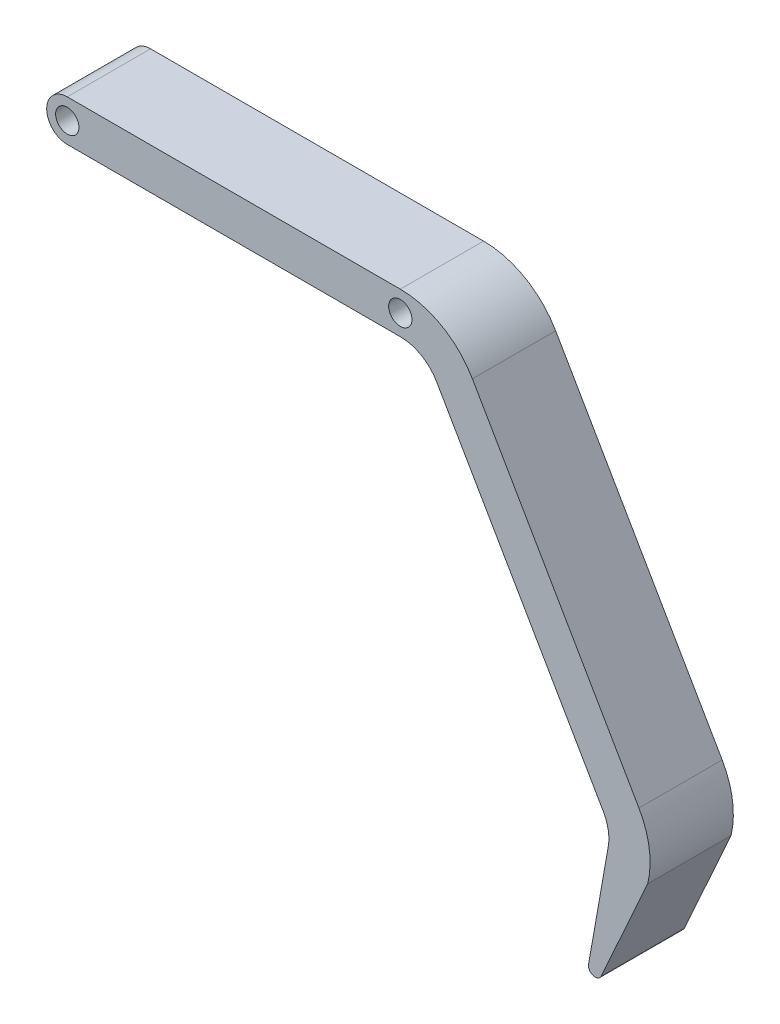
ISO-10303-21;
HEADER;
FILE_DESCRIPTION(('STEP AP214'),'2;1');
FILE_NAME('part.step','',(''),(''),'','','');
FILE_SCHEMA(('AUTOMOTIVE_DESIGN { 1 0 10303 214 1 1 1 1 }'));
ENDSEC;
DATA;
#1=APPLICATION_CONTEXT('core data for automotive mechanical design processes');
#2=APPLICATION_PROTOCOL_DEFINITION('international standard','automotive_design',2000,#1);
#3=PRODUCT_CONTEXT('',#1,'mechanical');
#4=PRODUCT('Part','Part','',(#3));
#5=PRODUCT_RELATED_PRODUCT_CATEGORY('part','',(#4));
#6=PRODUCT_DEFINITION_FORMATION('','',#4);
#7=PRODUCT_DEFINITION_CONTEXT('part definition',#1,'design');
#8=PRODUCT_DEFINITION('design','',#6,#7);
#9=PRODUCT_DEFINITION_SHAPE('','',#8);
#10=(LENGTH_UNIT() NAMED_UNIT(*) SI_UNIT(.MILLI.,.METRE.));
#11=(NAMED_UNIT(*) PLANE_ANGLE_UNIT() SI_UNIT($,.RADIAN.));
#12=(NAMED_UNIT(*) SI_UNIT($,.STERADIAN.) SOLID_ANGLE_UNIT());
#13=UNCERTAINTY_MEASURE_WITH_UNIT(LENGTH_MEASURE(1.E-05),#10,'distance_accuracy_value','');
#14=(GEOMETRIC_REPRESENTATION_CONTEXT(3) GLOBAL_UNCERTAINTY_ASSIGNED_CONTEXT((#13)) GLOBAL_UNIT_ASSIGNED_CONTEXT((#10,
#11,#12)) REPRESENTATION_CONTEXT('',''));
#15=CARTESIAN_POINT('',(0.,0.,0.));
#16=DIRECTION('',(0.,0.,1.));
#17=DIRECTION('',(1.,0.,0.));
#18=AXIS2_PLACEMENT_3D('',#15,#16,#17);
#19=CARTESIAN_POINT('',(-25.4,-3.14284244351836,12.7));
#20=DIRECTION('',(0.,0.,-1.));
#21=DIRECTION('',(-1.,0.,0.));
#22=AXIS2_PLACEMENT_3D('',#19,#20,#21);
#23=CYLINDRICAL_SURFACE('',#22,3.14284244351837);
#24=CARTESIAN_POINT('',(-25.4,-3.14284244351836,0.));
#25=DIRECTION('',(0.,0.,1.));
#26=DIRECTION('',(1.,0.,0.));
#27=AXIS2_PLACEMENT_3D('',#24,#25,#26);
#28=CIRCLE('',#27,3.14284244351837);
#29=CARTESIAN_POINT('',(-25.4,0.,0.));
#30=VERTEX_POINT('',#29);
#31=CARTESIAN_POINT('',(-25.4,-6.28568488703673,0.));
#32=VERTEX_POINT('',#31);
#33=EDGE_CURVE('E151',#30,#32,#28,.T.);
#34=ORIENTED_EDGE('',*,*,#33,.T.);
#35=DIRECTION('',(0.,0.,-1.));
#36=VECTOR('',#35,1.);
#37=CARTESIAN_POINT('',(-25.4,-6.28568488703673,12.7));
#38=LINE('',#37,#36);
#39=CARTESIAN_POINT('',(-25.4,-6.28568488703673,12.7));
#40=VERTEX_POINT('',#39);
#41=EDGE_CURVE('E132',#40,#32,#38,.T.);
#42=ORIENTED_EDGE('',*,*,#41,.F.);
#43=CARTESIAN_POINT('',(-25.4,-3.14284244351836,12.7));
#44=DIRECTION('',(0.,0.,1.));
#45=DIRECTION('',(1.,0.,0.));
#46=AXIS2_PLACEMENT_3D('',#43,#44,#45);
#47=CIRCLE('',#46,3.14284244351837);
#48=CARTESIAN_POINT('',(-25.4,0.,12.7));
#49=VERTEX_POINT('',#48);
#50=EDGE_CURVE('E139',#49,#40,#47,.T.);
#51=ORIENTED_EDGE('',*,*,#50,.F.);
#52=DIRECTION('',(0.,0.,-1.));
#53=VECTOR('',#52,1.);
#54=CARTESIAN_POINT('',(-25.4,0.,12.7));
#55=LINE('',#54,#53);
#56=EDGE_CURVE('E180',#49,#30,#55,.T.);
#57=ORIENTED_EDGE('',*,*,#56,.T.);
#58=EDGE_LOOP('',(#34,#42,#51,#57));
#59=FACE_BOUND('',#58,.T.);
#60=ADVANCED_FACE('F39',(#59),#23,.T.);
#61=CARTESIAN_POINT('',(-25.4,-6.28568488703673,12.7));
#62=DIRECTION('',(0.,1.,0.));
#63=DIRECTION('',(-1.,0.,0.));
#64=AXIS2_PLACEMENT_3D('',#61,#62,#63);
#65=PLANE('',#64);
#66=DIRECTION('',(1.,0.,0.));
#67=VECTOR('',#66,1.);
#68=CARTESIAN_POINT('',(-25.4,-6.28568488703673,0.));
#69=LINE('',#68,#67);
#70=CARTESIAN_POINT('',(25.4,-6.28568488703674,0.));
#71=VERTEX_POINT('',#70);
#72=EDGE_CURVE('E199',#32,#71,#69,.T.);
#73=ORIENTED_EDGE('',*,*,#72,.T.);
#74=DIRECTION('',(0.,0.,-1.));
#75=VECTOR('',#74,1.);
#76=CARTESIAN_POINT('',(25.4,-6.28568488703674,12.7));
#77=LINE('',#76,#75);
#78=CARTESIAN_POINT('',(25.4,-6.28568488703674,12.7));
#79=VERTEX_POINT('',#78);
#80=EDGE_CURVE('E135',#79,#71,#77,.T.);
#81=ORIENTED_EDGE('',*,*,#80,.F.);
#82=DIRECTION('',(1.,0.,0.));
#83=VECTOR('',#82,1.);
#84=CARTESIAN_POINT('',(-25.4,-6.28568488703673,12.7));
#85=LINE('',#84,#83);
#86=EDGE_CURVE('E128',#40,#79,#85,.T.);
#87=ORIENTED_EDGE('',*,*,#86,.F.);
#88=ORIENTED_EDGE('',*,*,#41,.T.);
#89=EDGE_LOOP('',(#73,#81,#87,#88));
#90=FACE_BOUND('',#89,.T.);
#91=ADVANCED_FACE('F130',(#90),#65,.F.);
#92=CARTESIAN_POINT('',(25.4,-12.7,12.7));
#93=DIRECTION('',(0.,0.,-1.));
#94=DIRECTION('',(-1.,0.,0.));
#95=AXIS2_PLACEMENT_3D('',#92,#93,#94);
#96=CYLINDRICAL_SURFACE('',#95,6.41431511296327);
#97=CARTESIAN_POINT('',(25.4,-12.7,0.));
#98=DIRECTION('',(0.,0.,-1.));
#99=DIRECTION('',(-1.,0.,0.));
#100=AXIS2_PLACEMENT_3D('',#97,#98,#99);
#101=CIRCLE('',#100,6.41431511296327);
#102=CARTESIAN_POINT('',(30.9549598357046,-9.49284244351838,0.));
#103=VERTEX_POINT('',#102);
#104=EDGE_CURVE('E197',#71,#103,#101,.T.);
#105=ORIENTED_EDGE('',*,*,#104,.T.);
#106=DIRECTION('',(0.,0.,-1.));
#107=VECTOR('',#106,1.);
#108=CARTESIAN_POINT('',(30.9549598357046,-9.49284244351838,12.7));
#109=LINE('',#108,#107);
#110=CARTESIAN_POINT('',(30.9549598357046,-9.49284244351838,12.7));
#111=VERTEX_POINT('',#110);
#112=EDGE_CURVE('E156',#111,#103,#109,.T.);
#113=ORIENTED_EDGE('',*,*,#112,.F.);
#114=CARTESIAN_POINT('',(25.4,-12.7,12.7));
#115=DIRECTION('',(0.,0.,-1.));
#116=DIRECTION('',(-1.,0.,0.));
#117=AXIS2_PLACEMENT_3D('',#114,#115,#116);
#118=CIRCLE('',#117,6.41431511296327);
#119=EDGE_CURVE('E138',#79,#111,#118,.T.);
#120=ORIENTED_EDGE('',*,*,#119,.F.);
#121=ORIENTED_EDGE('',*,*,#80,.T.);
#122=EDGE_LOOP('',(#105,#113,#120,#121));
#123=FACE_BOUND('',#122,.T.);
#124=ADVANCED_FACE('F264',(#123),#96,.F.);
#125=CARTESIAN_POINT('',(30.9549598357046,-9.49284244351838,12.7));
#126=DIRECTION('',(0.86602540378444,0.499999999999998,0.));
#127=DIRECTION('',(-0.499999999999998,0.86602540378444,0.));
#128=AXIS2_PLACEMENT_3D('',#125,#126,#127);
#129=PLANE('',#128);
#130=DIRECTION('',(0.499999999999998,-0.86602540378444,0.));
#131=VECTOR('',#130,1.);
#132=CARTESIAN_POINT('',(30.9549598357046,-9.49284244351838,0.));
#133=LINE('',#132,#131);
#134=CARTESIAN_POINT('',(56.3549598357045,-53.4869329557679,0.));
#135=VERTEX_POINT('',#134);
#136=EDGE_CURVE('E195',#103,#135,#133,.T.);
#137=ORIENTED_EDGE('',*,*,#136,.T.);
#138=DIRECTION('',(0.,0.,-1.));
#139=VECTOR('',#138,1.);
#140=CARTESIAN_POINT('',(56.3549598357045,-53.4869329557679,12.7));
#141=LINE('',#140,#139);
#142=CARTESIAN_POINT('',(56.3549598357045,-53.4869329557679,12.7));
#143=VERTEX_POINT('',#142);
#144=EDGE_CURVE('E162',#143,#135,#141,.T.);
#145=ORIENTED_EDGE('',*,*,#144,.F.);
#146=DIRECTION('',(0.499999999999998,-0.86602540378444,0.));
#147=VECTOR('',#146,1.);
#148=CARTESIAN_POINT('',(30.9549598357046,-9.49284244351838,12.7));
#149=LINE('',#148,#147);
#150=EDGE_CURVE('E216',#111,#143,#149,.T.);
#151=ORIENTED_EDGE('',*,*,#150,.F.);
#152=ORIENTED_EDGE('',*,*,#112,.T.);
#153=EDGE_LOOP('',(#137,#145,#151,#152));
#154=FACE_BOUND('',#153,.T.);
#155=ADVANCED_FACE('F269',(#154),#129,.F.);
#156=CARTESIAN_POINT('',(50.7999999999999,-56.6940905122495,12.7));
#157=DIRECTION('',(0.,0.,-1.));
#158=DIRECTION('',(-1.,0.,0.));
#159=AXIS2_PLACEMENT_3D('',#156,#157,#158);
#160=CYLINDRICAL_SURFACE('',#159,6.41431511296323);
#161=CARTESIAN_POINT('',(50.7999999999999,-56.6940905122495,0.));
#162=DIRECTION('',(0.,0.,-1.));
#163=DIRECTION('',(-1.,0.,0.));
#164=AXIS2_PLACEMENT_3D('',#161,#162,#163);
#165=CIRCLE('',#164,6.41431511296323);
#166=CARTESIAN_POINT('',(57.1168672535094,-57.8079246425971,0.));
#167=VERTEX_POINT('',#166);
#168=EDGE_CURVE('E193',#135,#167,#165,.T.);
#169=ORIENTED_EDGE('',*,*,#168,.T.);
#170=DIRECTION('',(0.,0.,-1.));
#171=VECTOR('',#170,1.);
#172=CARTESIAN_POINT('',(57.1168672535094,-57.8079246425971,12.7));
#173=LINE('',#172,#171);
#174=CARTESIAN_POINT('',(57.1168672535094,-57.8079246425971,12.7));
#175=VERTEX_POINT('',#174);
#176=EDGE_CURVE('E165',#175,#167,#173,.T.);
#177=ORIENTED_EDGE('',*,*,#176,.F.);
#178=CARTESIAN_POINT('',(50.7999999999999,-56.6940905122495,12.7));
#179=DIRECTION('',(0.,0.,-1.));
#180=DIRECTION('',(-1.,0.,0.));
#181=AXIS2_PLACEMENT_3D('',#178,#179,#180);
#182=CIRCLE('',#181,6.41431511296323);
#183=EDGE_CURVE('E214',#143,#175,#182,.T.);
#184=ORIENTED_EDGE('',*,*,#183,.F.);
#185=ORIENTED_EDGE('',*,*,#144,.T.);
#186=EDGE_LOOP('',(#169,#177,#184,#185));
#187=FACE_BOUND('',#186,.T.);
#188=ADVANCED_FACE('F273',(#187),#160,.F.);
#189=CARTESIAN_POINT('',(57.1168672535094,-57.8079246425971,12.7));
#190=DIRECTION('',(0.984807753012207,-0.173648177666935,0.));
#191=DIRECTION('',(0.173648177666935,0.984807753012207,0.));
#192=AXIS2_PLACEMENT_3D('',#189,#190,#191);
#193=PLANE('',#192);
#194=DIRECTION('',(-0.173648177666935,-0.984807753012207,0.));
#195=VECTOR('',#194,1.);
#196=CARTESIAN_POINT('',(57.1168672535094,-57.8079246425971,0.));
#197=LINE('',#196,#195);
#198=CARTESIAN_POINT('',(54.115484799693,-74.8296103866452,0.));
#199=VERTEX_POINT('',#198);
#200=EDGE_CURVE('E191',#167,#199,#197,.T.);
#201=ORIENTED_EDGE('',*,*,#200,.T.);
#202=DIRECTION('',(0.,0.,-1.));
#203=VECTOR('',#202,1.);
#204=CARTESIAN_POINT('',(54.115484799693,-74.8296103866452,12.7));
#205=LINE('',#204,#203);
#206=CARTESIAN_POINT('',(54.115484799693,-74.8296103866452,12.7));
#207=VERTEX_POINT('',#206);
#208=EDGE_CURVE('E47',#199,#207,#205,.F.);
#209=ORIENTED_EDGE('',*,*,#208,.T.);
#210=DIRECTION('',(-0.173648177666935,-0.984807753012207,0.));
#211=VECTOR('',#210,1.);
#212=CARTESIAN_POINT('',(57.1168672535094,-57.8079246425971,12.7));
#213=LINE('',#212,#211);
#214=EDGE_CURVE('E212',#175,#207,#213,.T.);
#215=ORIENTED_EDGE('',*,*,#214,.F.);
#216=ORIENTED_EDGE('',*,*,#176,.T.);
#217=EDGE_LOOP('',(#201,#209,#215,#216));
#218=FACE_BOUND('',#217,.T.);
#219=ADVANCED_FACE('F277',(#218),#193,.F.);
#220=CARTESIAN_POINT('',(52.7062035407693,-82.8220415691072,12.7));
#221=DIRECTION('',(-0.911608864925694,0.411058727420898,0.));
#222=DIRECTION('',(-0.411058727420898,-0.911608864925694,0.));
#223=AXIS2_PLACEMENT_3D('',#220,#221,#222);
#224=PLANE('',#223);
#225=DIRECTION('',(0.411058727420898,0.911608864925694,0.));
#226=VECTOR('',#225,1.);
#227=CARTESIAN_POINT('',(52.7062035407693,-82.8220415691072,12.7));
#228=LINE('',#227,#226);
#229=CARTESIAN_POINT('',(56.0422440835179,-75.4236726022145,12.7));
#230=VERTEX_POINT('',#229);
#231=CARTESIAN_POINT('',(63.1470952172601,-59.6671763999946,12.7));
#232=VERTEX_POINT('',#231);
#233=EDGE_CURVE('E210',#230,#232,#228,.T.);
#234=ORIENTED_EDGE('',*,*,#233,.F.);
#235=DIRECTION('',(0.,0.,-1.));
#236=VECTOR('',#235,1.);
#237=CARTESIAN_POINT('',(56.0422440835179,-75.4236726022145,12.7));
#238=LINE('',#237,#236);
#239=CARTESIAN_POINT('',(56.0422440835179,-75.4236726022145,0.));
#240=VERTEX_POINT('',#239);
#241=EDGE_CURVE('E152',#230,#240,#238,.T.);
#242=ORIENTED_EDGE('',*,*,#241,.T.);
#243=DIRECTION('',(0.411058727420898,0.911608864925694,0.));
#244=VECTOR('',#243,1.);
#245=CARTESIAN_POINT('',(52.7062035407693,-82.8220415691072,0.));
#246=LINE('',#245,#244);
#247=CARTESIAN_POINT('',(63.1470952172601,-59.6671763999946,0.));
#248=VERTEX_POINT('',#247);
#249=EDGE_CURVE('E189',#240,#248,#246,.T.);
#250=ORIENTED_EDGE('',*,*,#249,.T.);
#251=DIRECTION('',(0.,0.,-1.));
#252=VECTOR('',#251,1.);
#253=CARTESIAN_POINT('',(63.1470952172601,-59.6671763999946,12.7));
#254=LINE('',#253,#252);
#255=EDGE_CURVE('E168',#232,#248,#254,.T.);
#256=ORIENTED_EDGE('',*,*,#255,.F.);
#257=EDGE_LOOP('',(#234,#242,#250,#256));
#258=FACE_BOUND('',#257,.T.);
#259=ADVANCED_FACE('F245',(#258),#224,.F.);
#260=CARTESIAN_POINT('',(50.7999999999999,-56.6940905122495,12.7));
#261=DIRECTION('',(0.,0.,-1.));
#262=DIRECTION('',(-1.,0.,0.));
#263=AXIS2_PLACEMENT_3D('',#260,#261,#262);
#264=CYLINDRICAL_SURFACE('',#263,12.7);
#265=CARTESIAN_POINT('',(50.7999999999999,-56.6940905122495,0.));
#266=DIRECTION('',(0.,0.,1.));
#267=DIRECTION('',(-1.,0.,0.));
#268=AXIS2_PLACEMENT_3D('',#265,#266,#267);
#269=CIRCLE('',#268,12.7);
#270=CARTESIAN_POINT('',(61.7985226280623,-50.3440905122496,0.));
#271=VERTEX_POINT('',#270);
#272=EDGE_CURVE('E187',#248,#271,#269,.T.);
#273=ORIENTED_EDGE('',*,*,#272,.T.);
#274=DIRECTION('',(0.,0.,-1.));
#275=VECTOR('',#274,1.);
#276=CARTESIAN_POINT('',(61.7985226280623,-50.3440905122496,12.7));
#277=LINE('',#276,#275);
#278=CARTESIAN_POINT('',(61.7985226280623,-50.3440905122496,12.7));
#279=VERTEX_POINT('',#278);
#280=EDGE_CURVE('E171',#279,#271,#277,.T.);
#281=ORIENTED_EDGE('',*,*,#280,.F.);
#282=CARTESIAN_POINT('',(50.7999999999999,-56.6940905122495,12.7));
#283=DIRECTION('',(0.,0.,1.));
#284=DIRECTION('',(-1.,0.,0.));
#285=AXIS2_PLACEMENT_3D('',#282,#283,#284);
#286=CIRCLE('',#285,12.7);
#287=EDGE_CURVE('E208',#232,#279,#286,.T.);
#288=ORIENTED_EDGE('',*,*,#287,.F.);
#289=ORIENTED_EDGE('',*,*,#255,.T.);
#290=EDGE_LOOP('',(#273,#281,#288,#289));
#291=FACE_BOUND('',#290,.T.);
#292=ADVANCED_FACE('F249',(#291),#264,.T.);
#293=CARTESIAN_POINT('',(36.3985226280624,-6.35000000000002,12.7));
#294=DIRECTION('',(-0.86602540378444,-0.499999999999998,0.));
#295=DIRECTION('',(0.499999999999998,-0.86602540378444,0.));
#296=AXIS2_PLACEMENT_3D('',#293,#294,#295);
#297=PLANE('',#296);
#298=DIRECTION('',(-0.499999999999998,0.86602540378444,0.));
#299=VECTOR('',#298,1.);
#300=CARTESIAN_POINT('',(36.3985226280624,-6.35000000000002,0.));
#301=LINE('',#300,#299);
#302=CARTESIAN_POINT('',(36.3985226280624,-6.35000000000002,0.));
#303=VERTEX_POINT('',#302);
#304=EDGE_CURVE('E185',#271,#303,#301,.T.);
#305=ORIENTED_EDGE('',*,*,#304,.T.);
#306=DIRECTION('',(0.,0.,-1.));
#307=VECTOR('',#306,1.);
#308=CARTESIAN_POINT('',(36.3985226280624,-6.35000000000002,12.7));
#309=LINE('',#308,#307);
#310=CARTESIAN_POINT('',(36.3985226280624,-6.35000000000002,12.7));
#311=VERTEX_POINT('',#310);
#312=EDGE_CURVE('E174',#311,#303,#309,.T.);
#313=ORIENTED_EDGE('',*,*,#312,.F.);
#314=DIRECTION('',(-0.499999999999998,0.86602540378444,0.));
#315=VECTOR('',#314,1.);
#316=CARTESIAN_POINT('',(36.3985226280624,-6.35000000000002,12.7));
#317=LINE('',#316,#315);
#318=EDGE_CURVE('E206',#279,#311,#317,.T.);
#319=ORIENTED_EDGE('',*,*,#318,.F.);
#320=ORIENTED_EDGE('',*,*,#280,.T.);
#321=EDGE_LOOP('',(#305,#313,#319,#320));
#322=FACE_BOUND('',#321,.T.);
#323=ADVANCED_FACE('F285',(#322),#297,.F.);
#324=CARTESIAN_POINT('',(25.4,-12.7,12.7));
#325=DIRECTION('',(0.,0.,-1.));
#326=DIRECTION('',(-1.,0.,0.));
#327=AXIS2_PLACEMENT_3D('',#324,#325,#326);
#328=CYLINDRICAL_SURFACE('',#327,12.7);
#329=CARTESIAN_POINT('',(25.4,-12.7,0.));
#330=DIRECTION('',(0.,0.,1.));
#331=DIRECTION('',(-1.,0.,0.));
#332=AXIS2_PLACEMENT_3D('',#329,#330,#331);
#333=CIRCLE('',#332,12.7);
#334=CARTESIAN_POINT('',(25.4,0.,0.));
#335=VERTEX_POINT('',#334);
#336=EDGE_CURVE('E183',#303,#335,#333,.T.);
#337=ORIENTED_EDGE('',*,*,#336,.T.);
#338=DIRECTION('',(0.,0.,-1.));
#339=VECTOR('',#338,1.);
#340=CARTESIAN_POINT('',(25.4,0.,12.7));
#341=LINE('',#340,#339);
#342=CARTESIAN_POINT('',(25.4,0.,12.7));
#343=VERTEX_POINT('',#342);
#344=EDGE_CURVE('E177',#343,#335,#341,.T.);
#345=ORIENTED_EDGE('',*,*,#344,.F.);
#346=CARTESIAN_POINT('',(25.4,-12.7,12.7));
#347=DIRECTION('',(0.,0.,1.));
#348=DIRECTION('',(-1.,0.,0.));
#349=AXIS2_PLACEMENT_3D('',#346,#347,#348);
#350=CIRCLE('',#349,12.7);
#351=EDGE_CURVE('E204',#311,#343,#350,.T.);
#352=ORIENTED_EDGE('',*,*,#351,.F.);
#353=ORIENTED_EDGE('',*,*,#312,.T.);
#354=EDGE_LOOP('',(#337,#345,#352,#353));
#355=FACE_BOUND('',#354,.T.);
#356=ADVANCED_FACE('F288',(#355),#328,.T.);
#357=CARTESIAN_POINT('',(-25.4,0.,12.7));
#358=DIRECTION('',(0.,-1.,0.));
#359=DIRECTION('',(0.,0.,-1.));
#360=AXIS2_PLACEMENT_3D('',#357,#358,#359);
#361=PLANE('',#360);
#362=DIRECTION('',(-1.,0.,0.));
#363=VECTOR('',#362,1.);
#364=CARTESIAN_POINT('',(-25.4,0.,0.));
#365=LINE('',#364,#363);
#366=EDGE_CURVE('E148',#335,#30,#365,.T.);
#367=ORIENTED_EDGE('',*,*,#366,.T.);
#368=ORIENTED_EDGE('',*,*,#56,.F.);
#369=DIRECTION('',(-1.,0.,0.));
#370=VECTOR('',#369,1.);
#371=CARTESIAN_POINT('',(-25.4,0.,12.7));
#372=LINE('',#371,#370);
#373=EDGE_CURVE('E144',#343,#49,#372,.T.);
#374=ORIENTED_EDGE('',*,*,#373,.F.);
#375=ORIENTED_EDGE('',*,*,#344,.T.);
#376=EDGE_LOOP('',(#367,#368,#374,#375));
#377=FACE_BOUND('',#376,.T.);
#378=ADVANCED_FACE('F292',(#377),#361,.F.);
#379=CARTESIAN_POINT('',(-25.4,-3.14284244351836,12.7));
#380=DIRECTION('',(0.,0.,1.));
#381=DIRECTION('',(1.,0.,0.));
#382=AXIS2_PLACEMENT_3D('',#379,#380,#381);
#383=PLANE('',#382);
#384=CARTESIAN_POINT('',(25.4,-3.14284244351836,12.7));
#385=DIRECTION('',(0.,0.,-1.));
#386=DIRECTION('',(-1.,0.,0.));
#387=AXIS2_PLACEMENT_3D('',#384,#385,#386);
#388=CIRCLE('',#387,1.778);
#389=CARTESIAN_POINT('',(23.622,-3.14284244351836,12.7));
#390=VERTEX_POINT('',#389);
#391=EDGE_CURVE('E225',#390,#390,#388,.T.);
#392=ORIENTED_EDGE('',*,*,#391,.T.);
#393=EDGE_LOOP('',(#392));
#394=FACE_BOUND('',#393,.T.);
#395=CARTESIAN_POINT('',(-25.4,-3.14284244351836,12.7));
#396=DIRECTION('',(0.,0.,1.));
#397=DIRECTION('',(1.,0.,0.));
#398=AXIS2_PLACEMENT_3D('',#395,#396,#397);
#399=CIRCLE('',#398,1.778);
#400=CARTESIAN_POINT('',(-23.622,-3.14284244351836,12.7));
#401=VERTEX_POINT('',#400);
#402=EDGE_CURVE('E219',#401,#401,#399,.T.);
#403=ORIENTED_EDGE('',*,*,#402,.F.);
#404=EDGE_LOOP('',(#403));
#405=FACE_BOUND('',#404,.T.);
#406=ORIENTED_EDGE('',*,*,#214,.T.);
#407=CARTESIAN_POINT('',(55.1160494767534,-75.0060369351548,12.7));
#408=DIRECTION('',(0.,0.,1.));
#409=DIRECTION('',(1.,0.,0.));
#410=AXIS2_PLACEMENT_3D('',#407,#408,#409);
#411=CIRCLE('',#410,1.016);
#412=EDGE_CURVE('E11',#207,#230,#411,.T.);
#413=ORIENTED_EDGE('',*,*,#412,.T.);
#414=ORIENTED_EDGE('',*,*,#233,.T.);
#415=ORIENTED_EDGE('',*,*,#287,.T.);
#416=ORIENTED_EDGE('',*,*,#318,.T.);
#417=ORIENTED_EDGE('',*,*,#351,.T.);
#418=ORIENTED_EDGE('',*,*,#373,.T.);
#419=ORIENTED_EDGE('',*,*,#50,.T.);
#420=ORIENTED_EDGE('',*,*,#86,.T.);
#421=ORIENTED_EDGE('',*,*,#119,.T.);
#422=ORIENTED_EDGE('',*,*,#150,.T.);
#423=ORIENTED_EDGE('',*,*,#183,.T.);
#424=EDGE_LOOP('',(#406,#413,#414,#415,#416,#417,#418,#419,#420,#421,#422,#423));
#425=FACE_BOUND('',#424,.T.);
#426=ADVANCED_FACE('F142',(#394,#405,#425),#383,.T.);
#427=CARTESIAN_POINT('',(-25.4,-3.14284244351836,0.));
#428=DIRECTION('',(0.,0.,1.));
#429=DIRECTION('',(1.,0.,0.));
#430=AXIS2_PLACEMENT_3D('',#427,#428,#429);
#431=PLANE('',#430);
#432=CARTESIAN_POINT('',(25.4,-3.14284244351836,0.));
#433=DIRECTION('',(0.,0.,-1.));
#434=DIRECTION('',(-1.,0.,0.));
#435=AXIS2_PLACEMENT_3D('',#432,#433,#434);
#436=CIRCLE('',#435,1.778);
#437=CARTESIAN_POINT('',(23.622,-3.14284244351836,0.));
#438=VERTEX_POINT('',#437);
#439=EDGE_CURVE('E222',#438,#438,#436,.T.);
#440=ORIENTED_EDGE('',*,*,#439,.F.);
#441=EDGE_LOOP('',(#440));
#442=FACE_BOUND('',#441,.T.);
#443=CARTESIAN_POINT('',(-25.4,-3.14284244351836,0.));
#444=DIRECTION('',(0.,0.,1.));
#445=DIRECTION('',(1.,0.,0.));
#446=AXIS2_PLACEMENT_3D('',#443,#444,#445);
#447=CIRCLE('',#446,1.778);
#448=CARTESIAN_POINT('',(-23.622,-3.14284244351836,0.));
#449=VERTEX_POINT('',#448);
#450=EDGE_CURVE('E202',#449,#449,#447,.T.);
#451=ORIENTED_EDGE('',*,*,#450,.T.);
#452=EDGE_LOOP('',(#451));
#453=FACE_BOUND('',#452,.T.);
#454=ORIENTED_EDGE('',*,*,#249,.F.);
#455=CARTESIAN_POINT('',(55.1160494767534,-75.0060369351548,0.));
#456=DIRECTION('',(0.,0.,1.));
#457=DIRECTION('',(1.,0.,0.));
#458=AXIS2_PLACEMENT_3D('',#455,#456,#457);
#459=CIRCLE('',#458,1.016);
#460=EDGE_CURVE('E61',#240,#199,#459,.F.);
#461=ORIENTED_EDGE('',*,*,#460,.T.);
#462=ORIENTED_EDGE('',*,*,#200,.F.);
#463=ORIENTED_EDGE('',*,*,#168,.F.);
#464=ORIENTED_EDGE('',*,*,#136,.F.);
#465=ORIENTED_EDGE('',*,*,#104,.F.);
#466=ORIENTED_EDGE('',*,*,#72,.F.);
#467=ORIENTED_EDGE('',*,*,#33,.F.);
#468=ORIENTED_EDGE('',*,*,#366,.F.);
#469=ORIENTED_EDGE('',*,*,#336,.F.);
#470=ORIENTED_EDGE('',*,*,#304,.F.);
#471=ORIENTED_EDGE('',*,*,#272,.F.);
#472=EDGE_LOOP('',(#454,#461,#462,#463,#464,#465,#466,#467,#468,#469,#470,#471));
#473=FACE_BOUND('',#472,.T.);
#474=ADVANCED_FACE('F234',(#442,#453,#473),#431,.F.);
#475=CARTESIAN_POINT('',(-25.4,-3.14284244351836,0.));
#476=DIRECTION('',(0.,0.,1.));
#477=DIRECTION('',(1.,0.,0.));
#478=AXIS2_PLACEMENT_3D('',#475,#476,#477);
#479=CYLINDRICAL_SURFACE('',#478,1.778);
#480=ORIENTED_EDGE('',*,*,#450,.F.);
#481=EDGE_LOOP('',(#480));
#482=FACE_BOUND('',#481,.T.);
#483=ORIENTED_EDGE('',*,*,#402,.T.);
#484=EDGE_LOOP('',(#483));
#485=FACE_BOUND('',#484,.T.);
#486=ADVANCED_FACE('F237',(#482,#485),#479,.F.);
#487=CARTESIAN_POINT('',(25.4,-3.14284244351836,0.));
#488=DIRECTION('',(0.,0.,1.));
#489=DIRECTION('',(1.,0.,0.));
#490=AXIS2_PLACEMENT_3D('',#487,#488,#489);
#491=CYLINDRICAL_SURFACE('',#490,1.778);
#492=ORIENTED_EDGE('',*,*,#439,.T.);
#493=EDGE_LOOP('',(#492));
#494=FACE_BOUND('',#493,.T.);
#495=ORIENTED_EDGE('',*,*,#391,.F.);
#496=EDGE_LOOP('',(#495));
#497=FACE_BOUND('',#496,.T.);
#498=ADVANCED_FACE('F231',(#494,#497),#491,.F.);
#499=CARTESIAN_POINT('',(55.1160494767534,-75.0060369351548,12.7));
#500=DIRECTION('',(0.,0.,-1.));
#501=DIRECTION('',(-1.,0.,0.));
#502=AXIS2_PLACEMENT_3D('',#499,#500,#501);
#503=CYLINDRICAL_SURFACE('',#502,1.016);
#504=ORIENTED_EDGE('',*,*,#412,.F.);
#505=ORIENTED_EDGE('',*,*,#208,.F.);
#506=ORIENTED_EDGE('',*,*,#460,.F.);
#507=ORIENTED_EDGE('',*,*,#241,.F.);
#508=EDGE_LOOP('',(#504,#505,#506,#507));
#509=FACE_BOUND('',#508,.T.);
#510=ADVANCED_FACE('F41',(#509),#503,.T.);
#511=CLOSED_SHELL('',(#60,#91,#124,#155,#188,#219,#259,#292,#323,#356,#378,#426,#474,#486,#498,#510));
#512=MANIFOLD_SOLID_BREP('B2',#511);
#513=ADVANCED_BREP_SHAPE_REPRESENTATION('',(#18,#512),#14);
#514=SHAPE_DEFINITION_REPRESENTATION(#9,#513);
ENDSEC;
END-ISO-10303-21;
